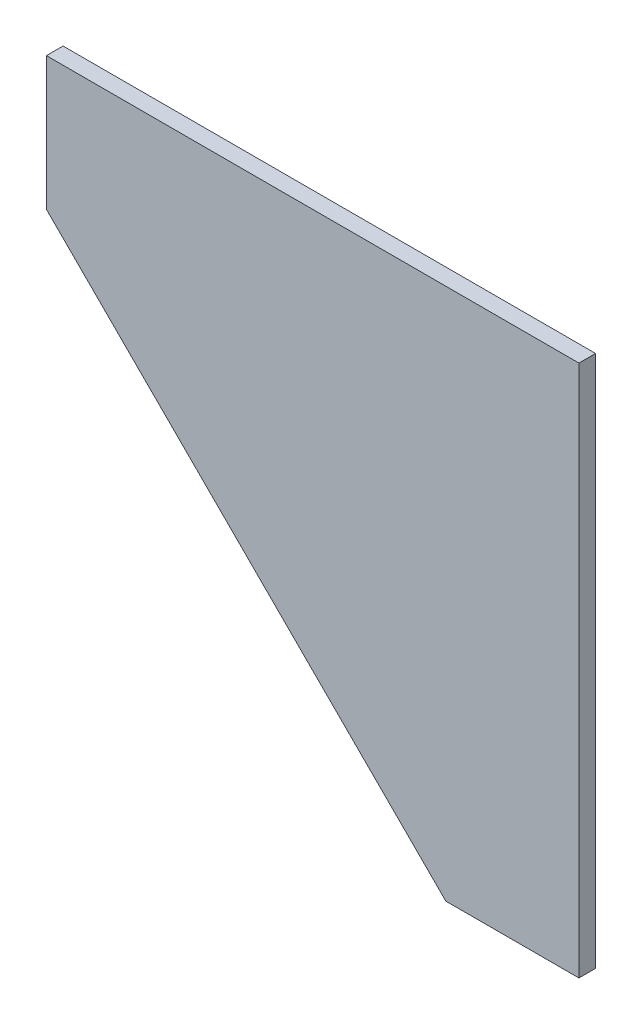
ISO-10303-21;
HEADER;
FILE_DESCRIPTION(('STEP AP214'),'2;1');
FILE_NAME('part.step','',(''),(''),'','','');
FILE_SCHEMA(('AUTOMOTIVE_DESIGN { 1 0 10303 214 1 1 1 1 }'));
ENDSEC;
DATA;
#1=APPLICATION_CONTEXT('core data for automotive mechanical design processes');
#2=APPLICATION_PROTOCOL_DEFINITION('international standard','automotive_design',2000,#1);
#3=PRODUCT_CONTEXT('',#1,'mechanical');
#4=PRODUCT('Part','Part','',(#3));
#5=PRODUCT_RELATED_PRODUCT_CATEGORY('part','',(#4));
#6=PRODUCT_DEFINITION_FORMATION('','',#4);
#7=PRODUCT_DEFINITION_CONTEXT('part definition',#1,'design');
#8=PRODUCT_DEFINITION('design','',#6,#7);
#9=PRODUCT_DEFINITION_SHAPE('','',#8);
#10=(LENGTH_UNIT() NAMED_UNIT(*) SI_UNIT(.MILLI.,.METRE.));
#11=(NAMED_UNIT(*) PLANE_ANGLE_UNIT() SI_UNIT($,.RADIAN.));
#12=(NAMED_UNIT(*) SI_UNIT($,.STERADIAN.) SOLID_ANGLE_UNIT());
#13=UNCERTAINTY_MEASURE_WITH_UNIT(LENGTH_MEASURE(1.E-05),#10,'distance_accuracy_value','');
#14=(GEOMETRIC_REPRESENTATION_CONTEXT(3) GLOBAL_UNCERTAINTY_ASSIGNED_CONTEXT((#13)) GLOBAL_UNIT_ASSIGNED_CONTEXT((#10,
#11,#12)) REPRESENTATION_CONTEXT('',''));
#15=CARTESIAN_POINT('',(0.,0.,0.));
#16=DIRECTION('',(0.,0.,1.));
#17=DIRECTION('',(1.,0.,0.));
#18=AXIS2_PLACEMENT_3D('',#15,#16,#17);
#19=CARTESIAN_POINT('',(-50.8,0.,6.35));
#20=DIRECTION('',(0.,1.,0.));
#21=DIRECTION('',(0.,0.,1.));
#22=AXIS2_PLACEMENT_3D('',#19,#20,#21);
#23=PLANE('',#22);
#24=DIRECTION('',(1.,0.,0.));
#25=VECTOR('',#24,1.);
#26=CARTESIAN_POINT('',(-50.8,0.,0.));
#27=LINE('',#26,#25);
#28=CARTESIAN_POINT('',(-50.8,0.,0.));
#29=VERTEX_POINT('',#28);
#30=CARTESIAN_POINT('',(0.,0.,0.));
#31=VERTEX_POINT('',#30);
#32=EDGE_CURVE('E107',#29,#31,#27,.T.);
#33=ORIENTED_EDGE('',*,*,#32,.T.);
#34=DIRECTION('',(0.,0.,-1.));
#35=VECTOR('',#34,1.);
#36=CARTESIAN_POINT('',(0.,0.,6.35));
#37=LINE('',#36,#35);
#38=CARTESIAN_POINT('',(0.,0.,6.35));
#39=VERTEX_POINT('',#38);
#40=EDGE_CURVE('E11',#39,#31,#37,.T.);
#41=ORIENTED_EDGE('',*,*,#40,.F.);
#42=DIRECTION('',(1.,0.,0.));
#43=VECTOR('',#42,1.);
#44=CARTESIAN_POINT('',(-50.8,0.,6.35));
#45=LINE('',#44,#43);
#46=CARTESIAN_POINT('',(-50.8,0.,6.35));
#47=VERTEX_POINT('',#46);
#48=EDGE_CURVE('E115',#47,#39,#45,.T.);
#49=ORIENTED_EDGE('',*,*,#48,.F.);
#50=DIRECTION('',(0.,0.,-1.));
#51=VECTOR('',#50,1.);
#52=CARTESIAN_POINT('',(-50.8,0.,6.35));
#53=LINE('',#52,#51);
#54=EDGE_CURVE('E103',#47,#29,#53,.T.);
#55=ORIENTED_EDGE('',*,*,#54,.T.);
#56=EDGE_LOOP('',(#33,#41,#49,#55));
#57=FACE_BOUND('',#56,.T.);
#58=ADVANCED_FACE('F33',(#57),#23,.F.);
#59=CARTESIAN_POINT('',(0.,0.,6.35));
#60=DIRECTION('',(-1.,0.,0.));
#61=DIRECTION('',(0.,-1.,0.));
#62=AXIS2_PLACEMENT_3D('',#59,#60,#61);
#63=PLANE('',#62);
#64=DIRECTION('',(0.,1.,0.));
#65=VECTOR('',#64,1.);
#66=CARTESIAN_POINT('',(0.,0.,0.));
#67=LINE('',#66,#65);
#68=CARTESIAN_POINT('',(0.,203.2,0.));
#69=VERTEX_POINT('',#68);
#70=EDGE_CURVE('E110',#31,#69,#67,.T.);
#71=ORIENTED_EDGE('',*,*,#70,.T.);
#72=DIRECTION('',(0.,0.,-1.));
#73=VECTOR('',#72,1.);
#74=CARTESIAN_POINT('',(0.,203.2,6.35));
#75=LINE('',#74,#73);
#76=CARTESIAN_POINT('',(0.,203.2,6.35));
#77=VERTEX_POINT('',#76);
#78=EDGE_CURVE('E41',#77,#69,#75,.T.);
#79=ORIENTED_EDGE('',*,*,#78,.F.);
#80=DIRECTION('',(0.,1.,0.));
#81=VECTOR('',#80,1.);
#82=CARTESIAN_POINT('',(0.,0.,6.35));
#83=LINE('',#82,#81);
#84=EDGE_CURVE('E83',#39,#77,#83,.T.);
#85=ORIENTED_EDGE('',*,*,#84,.F.);
#86=ORIENTED_EDGE('',*,*,#40,.T.);
#87=EDGE_LOOP('',(#71,#79,#85,#86));
#88=FACE_BOUND('',#87,.T.);
#89=ADVANCED_FACE('F134',(#88),#63,.F.);
#90=CARTESIAN_POINT('',(0.,203.2,6.35));
#91=DIRECTION('',(0.,-1.,0.));
#92=DIRECTION('',(0.,0.,-1.));
#93=AXIS2_PLACEMENT_3D('',#90,#91,#92);
#94=PLANE('',#93);
#95=DIRECTION('',(-1.,0.,0.));
#96=VECTOR('',#95,1.);
#97=CARTESIAN_POINT('',(0.,203.2,0.));
#98=LINE('',#97,#96);
#99=CARTESIAN_POINT('',(-203.2,203.2,0.));
#100=VERTEX_POINT('',#99);
#101=EDGE_CURVE('E98',#69,#100,#98,.T.);
#102=ORIENTED_EDGE('',*,*,#101,.T.);
#103=DIRECTION('',(0.,0.,-1.));
#104=VECTOR('',#103,1.);
#105=CARTESIAN_POINT('',(-203.2,203.2,6.35));
#106=LINE('',#105,#104);
#107=CARTESIAN_POINT('',(-203.2,203.2,6.35));
#108=VERTEX_POINT('',#107);
#109=EDGE_CURVE('E95',#108,#100,#106,.T.);
#110=ORIENTED_EDGE('',*,*,#109,.F.);
#111=DIRECTION('',(-1.,0.,0.));
#112=VECTOR('',#111,1.);
#113=CARTESIAN_POINT('',(0.,203.2,6.35));
#114=LINE('',#113,#112);
#115=EDGE_CURVE('E87',#77,#108,#114,.T.);
#116=ORIENTED_EDGE('',*,*,#115,.F.);
#117=ORIENTED_EDGE('',*,*,#78,.T.);
#118=EDGE_LOOP('',(#102,#110,#116,#117));
#119=FACE_BOUND('',#118,.T.);
#120=ADVANCED_FACE('F96',(#119),#94,.F.);
#121=CARTESIAN_POINT('',(-203.2,203.2,6.35));
#122=DIRECTION('',(1.,0.,0.));
#123=DIRECTION('',(0.,0.,-1.));
#124=AXIS2_PLACEMENT_3D('',#121,#122,#123);
#125=PLANE('',#124);
#126=DIRECTION('',(0.,-1.,0.));
#127=VECTOR('',#126,1.);
#128=CARTESIAN_POINT('',(-203.2,203.2,0.));
#129=LINE('',#128,#127);
#130=CARTESIAN_POINT('',(-203.2,152.4,0.));
#131=VERTEX_POINT('',#130);
#132=EDGE_CURVE('E69',#100,#131,#129,.T.);
#133=ORIENTED_EDGE('',*,*,#132,.T.);
#134=DIRECTION('',(0.,0.,-1.));
#135=VECTOR('',#134,1.);
#136=CARTESIAN_POINT('',(-203.2,152.4,6.35));
#137=LINE('',#136,#135);
#138=CARTESIAN_POINT('',(-203.2,152.4,6.35));
#139=VERTEX_POINT('',#138);
#140=EDGE_CURVE('E99',#139,#131,#137,.T.);
#141=ORIENTED_EDGE('',*,*,#140,.F.);
#142=DIRECTION('',(0.,-1.,0.));
#143=VECTOR('',#142,1.);
#144=CARTESIAN_POINT('',(-203.2,203.2,6.35));
#145=LINE('',#144,#143);
#146=EDGE_CURVE('E91',#108,#139,#145,.T.);
#147=ORIENTED_EDGE('',*,*,#146,.F.);
#148=ORIENTED_EDGE('',*,*,#109,.T.);
#149=EDGE_LOOP('',(#133,#141,#147,#148));
#150=FACE_BOUND('',#149,.T.);
#151=ADVANCED_FACE('F101',(#150),#125,.F.);
#152=CARTESIAN_POINT('',(-203.2,152.4,6.35));
#153=DIRECTION('',(0.707106781186548,0.707106781186548,0.));
#154=DIRECTION('',(-0.707106781186547,0.707106781186548,0.));
#155=AXIS2_PLACEMENT_3D('',#152,#153,#154);
#156=PLANE('',#155);
#157=DIRECTION('',(0.707106781186547,-0.707106781186547,0.));
#158=VECTOR('',#157,1.);
#159=CARTESIAN_POINT('',(-203.2,152.4,0.));
#160=LINE('',#159,#158);
#161=EDGE_CURVE('E75',#131,#29,#160,.T.);
#162=ORIENTED_EDGE('',*,*,#161,.T.);
#163=ORIENTED_EDGE('',*,*,#54,.F.);
#164=DIRECTION('',(0.707106781186547,-0.707106781186547,0.));
#165=VECTOR('',#164,1.);
#166=CARTESIAN_POINT('',(-203.2,152.4,6.35));
#167=LINE('',#166,#165);
#168=EDGE_CURVE('E49',#139,#47,#167,.T.);
#169=ORIENTED_EDGE('',*,*,#168,.F.);
#170=ORIENTED_EDGE('',*,*,#140,.T.);
#171=EDGE_LOOP('',(#162,#163,#169,#170));
#172=FACE_BOUND('',#171,.T.);
#173=ADVANCED_FACE('F123',(#172),#156,.F.);
#174=CARTESIAN_POINT('',(0.,0.,6.35));
#175=DIRECTION('',(0.,0.,1.));
#176=DIRECTION('',(1.,0.,0.));
#177=AXIS2_PLACEMENT_3D('',#174,#175,#176);
#178=PLANE('',#177);
#179=ORIENTED_EDGE('',*,*,#48,.T.);
#180=ORIENTED_EDGE('',*,*,#84,.T.);
#181=ORIENTED_EDGE('',*,*,#115,.T.);
#182=ORIENTED_EDGE('',*,*,#146,.T.);
#183=ORIENTED_EDGE('',*,*,#168,.T.);
#184=EDGE_LOOP('',(#179,#180,#181,#182,#183));
#185=FACE_BOUND('',#184,.T.);
#186=ADVANCED_FACE('F89',(#185),#178,.T.);
#187=CARTESIAN_POINT('',(0.,0.,0.));
#188=DIRECTION('',(0.,0.,1.));
#189=DIRECTION('',(1.,0.,0.));
#190=AXIS2_PLACEMENT_3D('',#187,#188,#189);
#191=PLANE('',#190);
#192=ORIENTED_EDGE('',*,*,#32,.F.);
#193=ORIENTED_EDGE('',*,*,#161,.F.);
#194=ORIENTED_EDGE('',*,*,#132,.F.);
#195=ORIENTED_EDGE('',*,*,#101,.F.);
#196=ORIENTED_EDGE('',*,*,#70,.F.);
#197=EDGE_LOOP('',(#192,#193,#194,#195,#196));
#198=FACE_BOUND('',#197,.T.);
#199=ADVANCED_FACE('F119',(#198),#191,.F.);
#200=CLOSED_SHELL('',(#58,#89,#120,#151,#173,#186,#199));
#201=MANIFOLD_SOLID_BREP('B2',#200);
#202=ADVANCED_BREP_SHAPE_REPRESENTATION('',(#18,#201),#14);
#203=SHAPE_DEFINITION_REPRESENTATION(#9,#202);
ENDSEC;
END-ISO-10303-21;
